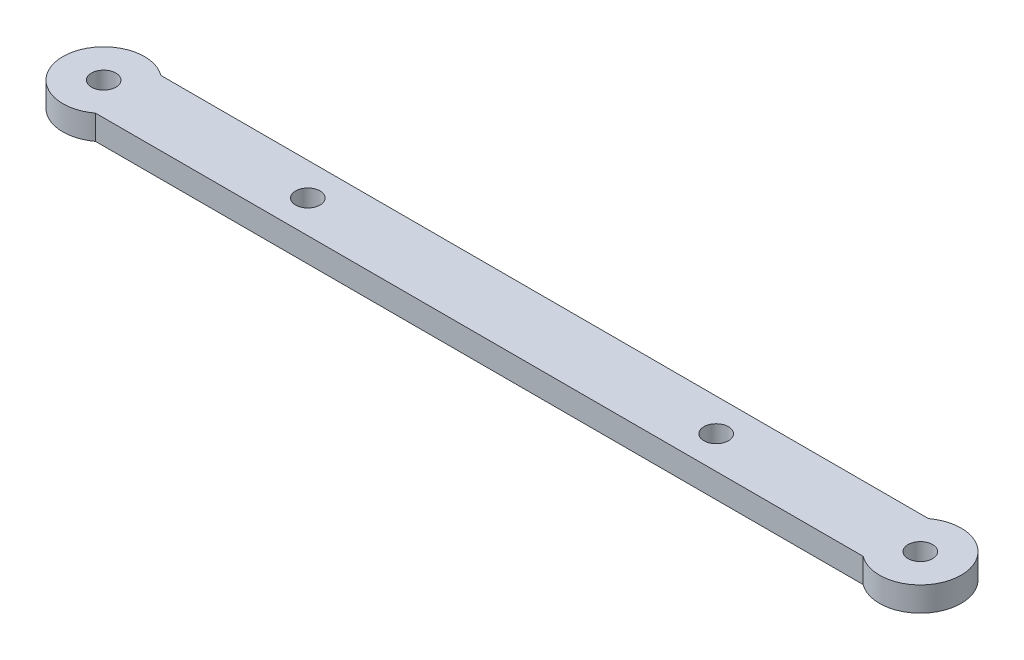
ISO-10303-21;
HEADER;
FILE_DESCRIPTION(('STEP AP214'),'2;1');
FILE_NAME('part.step','',(''),(''),'','','');
FILE_SCHEMA(('AUTOMOTIVE_DESIGN { 1 0 10303 214 1 1 1 1 }'));
ENDSEC;
DATA;
#1=APPLICATION_CONTEXT('core data for automotive mechanical design processes');
#2=APPLICATION_PROTOCOL_DEFINITION('international standard','automotive_design',2000,#1);
#3=PRODUCT_CONTEXT('',#1,'mechanical');
#4=PRODUCT('Part','Part','',(#3));
#5=PRODUCT_RELATED_PRODUCT_CATEGORY('part','',(#4));
#6=PRODUCT_DEFINITION_FORMATION('','',#4);
#7=PRODUCT_DEFINITION_CONTEXT('part definition',#1,'design');
#8=PRODUCT_DEFINITION('design','',#6,#7);
#9=PRODUCT_DEFINITION_SHAPE('','',#8);
#10=(LENGTH_UNIT() NAMED_UNIT(*) SI_UNIT(.MILLI.,.METRE.));
#11=(NAMED_UNIT(*) PLANE_ANGLE_UNIT() SI_UNIT($,.RADIAN.));
#12=(NAMED_UNIT(*) SI_UNIT($,.STERADIAN.) SOLID_ANGLE_UNIT());
#13=UNCERTAINTY_MEASURE_WITH_UNIT(LENGTH_MEASURE(1.E-05),#10,'distance_accuracy_value','');
#14=(GEOMETRIC_REPRESENTATION_CONTEXT(3) GLOBAL_UNCERTAINTY_ASSIGNED_CONTEXT((#13)) GLOBAL_UNIT_ASSIGNED_CONTEXT((#10,
#11,#12)) REPRESENTATION_CONTEXT('',''));
#15=CARTESIAN_POINT('',(0.,0.,0.));
#16=DIRECTION('',(0.,0.,1.));
#17=DIRECTION('',(1.,0.,0.));
#18=AXIS2_PLACEMENT_3D('',#15,#16,#17);
#19=CARTESIAN_POINT('',(50.,3.,0.));
#20=DIRECTION('',(0.,-1.,0.));
#21=DIRECTION('',(0.,0.,-1.));
#22=AXIS2_PLACEMENT_3D('',#19,#20,#21);
#23=PLANE('',#22);
#24=CARTESIAN_POINT('',(50.,3.,0.));
#25=DIRECTION('',(0.,1.,0.));
#26=DIRECTION('',(0.,0.,-1.));
#27=AXIS2_PLACEMENT_3D('',#24,#25,#26);
#28=CIRCLE('',#27,5.);
#29=CARTESIAN_POINT('',(47.,3.,3.99999999999999));
#30=VERTEX_POINT('',#29);
#31=CARTESIAN_POINT('',(47.,3.,-4.));
#32=VERTEX_POINT('',#31);
#33=EDGE_CURVE('E90',#30,#32,#28,.T.);
#34=ORIENTED_EDGE('',*,*,#33,.T.);
#35=DIRECTION('',(-1.,0.,0.));
#36=VECTOR('',#35,1.);
#37=CARTESIAN_POINT('',(-47.,3.,-4.));
#38=LINE('',#37,#36);
#39=CARTESIAN_POINT('',(-47.,3.,-4.));
#40=VERTEX_POINT('',#39);
#41=EDGE_CURVE('E85',#32,#40,#38,.T.);
#42=ORIENTED_EDGE('',*,*,#41,.T.);
#43=CARTESIAN_POINT('',(-50.,3.,0.));
#44=DIRECTION('',(0.,1.,0.));
#45=DIRECTION('',(0.,0.,1.));
#46=AXIS2_PLACEMENT_3D('',#43,#44,#45);
#47=CIRCLE('',#46,5.);
#48=CARTESIAN_POINT('',(-47.,3.,4.00000000000001));
#49=VERTEX_POINT('',#48);
#50=EDGE_CURVE('E88',#40,#49,#47,.T.);
#51=ORIENTED_EDGE('',*,*,#50,.T.);
#52=DIRECTION('',(1.,0.,0.));
#53=VECTOR('',#52,1.);
#54=CARTESIAN_POINT('',(47.,3.,3.99999999999999));
#55=LINE('',#54,#53);
#56=EDGE_CURVE('E55',#49,#30,#55,.T.);
#57=ORIENTED_EDGE('',*,*,#56,.T.);
#58=EDGE_LOOP('',(#34,#42,#51,#57));
#59=FACE_BOUND('',#58,.T.);
#60=CARTESIAN_POINT('',(-50.,3.,0.));
#61=DIRECTION('',(0.,1.,0.));
#62=DIRECTION('',(0.,0.,1.));
#63=AXIS2_PLACEMENT_3D('',#60,#61,#62);
#64=CIRCLE('',#63,1.5);
#65=CARTESIAN_POINT('',(-50.,3.,1.5));
#66=VERTEX_POINT('',#65);
#67=EDGE_CURVE('E105',#66,#66,#64,.T.);
#68=ORIENTED_EDGE('',*,*,#67,.F.);
#69=EDGE_LOOP('',(#68));
#70=FACE_BOUND('',#69,.T.);
#71=CARTESIAN_POINT('',(-25.,3.,0.));
#72=DIRECTION('',(0.,1.,0.));
#73=DIRECTION('',(0.,0.,1.));
#74=AXIS2_PLACEMENT_3D('',#71,#72,#73);
#75=CIRCLE('',#74,1.5);
#76=CARTESIAN_POINT('',(-25.,3.,1.5));
#77=VERTEX_POINT('',#76);
#78=EDGE_CURVE('E120',#77,#77,#75,.T.);
#79=ORIENTED_EDGE('',*,*,#78,.F.);
#80=EDGE_LOOP('',(#79));
#81=FACE_BOUND('',#80,.T.);
#82=CARTESIAN_POINT('',(50.,3.,0.));
#83=DIRECTION('',(0.,1.,0.));
#84=DIRECTION('',(0.,0.,-1.));
#85=AXIS2_PLACEMENT_3D('',#82,#83,#84);
#86=CIRCLE('',#85,1.5);
#87=CARTESIAN_POINT('',(50.,3.,-1.5));
#88=VERTEX_POINT('',#87);
#89=EDGE_CURVE('E126',#88,#88,#86,.T.);
#90=ORIENTED_EDGE('',*,*,#89,.F.);
#91=EDGE_LOOP('',(#90));
#92=FACE_BOUND('',#91,.T.);
#93=CARTESIAN_POINT('',(25.,3.,0.));
#94=DIRECTION('',(0.,1.,0.));
#95=DIRECTION('',(0.,0.,1.));
#96=AXIS2_PLACEMENT_3D('',#93,#94,#95);
#97=CIRCLE('',#96,1.5);
#98=CARTESIAN_POINT('',(25.,3.,1.5));
#99=VERTEX_POINT('',#98);
#100=EDGE_CURVE('E132',#99,#99,#97,.T.);
#101=ORIENTED_EDGE('',*,*,#100,.F.);
#102=EDGE_LOOP('',(#101));
#103=FACE_BOUND('',#102,.T.);
#104=ADVANCED_FACE('F38',(#59,#70,#81,#92,#103),#23,.F.);
#105=CARTESIAN_POINT('',(50.,0.,0.));
#106=DIRECTION('',(0.,-1.,0.));
#107=DIRECTION('',(0.,0.,-1.));
#108=AXIS2_PLACEMENT_3D('',#105,#106,#107);
#109=PLANE('',#108);
#110=CARTESIAN_POINT('',(50.,0.,0.));
#111=DIRECTION('',(0.,1.,0.));
#112=DIRECTION('',(0.,0.,-1.));
#113=AXIS2_PLACEMENT_3D('',#110,#111,#112);
#114=CIRCLE('',#113,1.5);
#115=CARTESIAN_POINT('',(50.,0.,-1.5));
#116=VERTEX_POINT('',#115);
#117=EDGE_CURVE('E129',#116,#116,#114,.T.);
#118=ORIENTED_EDGE('',*,*,#117,.T.);
#119=EDGE_LOOP('',(#118));
#120=FACE_BOUND('',#119,.T.);
#121=CARTESIAN_POINT('',(-50.,0.,0.));
#122=DIRECTION('',(0.,1.,0.));
#123=DIRECTION('',(0.,0.,1.));
#124=AXIS2_PLACEMENT_3D('',#121,#122,#123);
#125=CIRCLE('',#124,1.5);
#126=CARTESIAN_POINT('',(-50.,0.,1.5));
#127=VERTEX_POINT('',#126);
#128=EDGE_CURVE('E117',#127,#127,#125,.T.);
#129=ORIENTED_EDGE('',*,*,#128,.T.);
#130=EDGE_LOOP('',(#129));
#131=FACE_BOUND('',#130,.T.);
#132=CARTESIAN_POINT('',(50.,0.,0.));
#133=DIRECTION('',(0.,1.,0.));
#134=DIRECTION('',(0.,0.,-1.));
#135=AXIS2_PLACEMENT_3D('',#132,#133,#134);
#136=CIRCLE('',#135,5.);
#137=CARTESIAN_POINT('',(47.,0.,3.99999999999999));
#138=VERTEX_POINT('',#137);
#139=CARTESIAN_POINT('',(47.,0.,-4.));
#140=VERTEX_POINT('',#139);
#141=EDGE_CURVE('E102',#138,#140,#136,.T.);
#142=ORIENTED_EDGE('',*,*,#141,.F.);
#143=DIRECTION('',(1.,0.,0.));
#144=VECTOR('',#143,1.);
#145=CARTESIAN_POINT('',(47.,0.,3.99999999999999));
#146=LINE('',#145,#144);
#147=CARTESIAN_POINT('',(-47.,0.,4.00000000000001));
#148=VERTEX_POINT('',#147);
#149=EDGE_CURVE('E78',#148,#138,#146,.T.);
#150=ORIENTED_EDGE('',*,*,#149,.F.);
#151=CARTESIAN_POINT('',(-50.,0.,0.));
#152=DIRECTION('',(0.,1.,0.));
#153=DIRECTION('',(0.,0.,1.));
#154=AXIS2_PLACEMENT_3D('',#151,#152,#153);
#155=CIRCLE('',#154,5.);
#156=CARTESIAN_POINT('',(-47.,0.,-4.));
#157=VERTEX_POINT('',#156);
#158=EDGE_CURVE('E72',#157,#148,#155,.T.);
#159=ORIENTED_EDGE('',*,*,#158,.F.);
#160=DIRECTION('',(-1.,0.,0.));
#161=VECTOR('',#160,1.);
#162=CARTESIAN_POINT('',(-47.,0.,-4.));
#163=LINE('',#162,#161);
#164=EDGE_CURVE('E94',#140,#157,#163,.T.);
#165=ORIENTED_EDGE('',*,*,#164,.F.);
#166=EDGE_LOOP('',(#142,#150,#159,#165));
#167=FACE_BOUND('',#166,.T.);
#168=CARTESIAN_POINT('',(-25.,0.,0.));
#169=DIRECTION('',(0.,1.,0.));
#170=DIRECTION('',(0.,0.,1.));
#171=AXIS2_PLACEMENT_3D('',#168,#169,#170);
#172=CIRCLE('',#171,1.5);
#173=CARTESIAN_POINT('',(-25.,0.,1.5));
#174=VERTEX_POINT('',#173);
#175=EDGE_CURVE('E123',#174,#174,#172,.T.);
#176=ORIENTED_EDGE('',*,*,#175,.T.);
#177=EDGE_LOOP('',(#176));
#178=FACE_BOUND('',#177,.T.);
#179=CARTESIAN_POINT('',(25.,0.,0.));
#180=DIRECTION('',(0.,1.,0.));
#181=DIRECTION('',(0.,0.,1.));
#182=AXIS2_PLACEMENT_3D('',#179,#180,#181);
#183=CIRCLE('',#182,1.5);
#184=CARTESIAN_POINT('',(25.,0.,1.5));
#185=VERTEX_POINT('',#184);
#186=EDGE_CURVE('E135',#185,#185,#183,.T.);
#187=ORIENTED_EDGE('',*,*,#186,.T.);
#188=EDGE_LOOP('',(#187));
#189=FACE_BOUND('',#188,.T.);
#190=ADVANCED_FACE('F113',(#120,#131,#167,#178,#189),#109,.T.);
#191=CARTESIAN_POINT('',(50.,3.,0.));
#192=DIRECTION('',(0.,-1.,0.));
#193=DIRECTION('',(0.,0.,-1.));
#194=AXIS2_PLACEMENT_3D('',#191,#192,#193);
#195=CYLINDRICAL_SURFACE('',#194,5.);
#196=ORIENTED_EDGE('',*,*,#141,.T.);
#197=DIRECTION('',(0.,-1.,0.));
#198=VECTOR('',#197,1.);
#199=CARTESIAN_POINT('',(47.,3.,-4.));
#200=LINE('',#199,#198);
#201=EDGE_CURVE('E11',#32,#140,#200,.T.);
#202=ORIENTED_EDGE('',*,*,#201,.F.);
#203=ORIENTED_EDGE('',*,*,#33,.F.);
#204=DIRECTION('',(0.,-1.,0.));
#205=VECTOR('',#204,1.);
#206=CARTESIAN_POINT('',(47.,3.,3.99999999999999));
#207=LINE('',#206,#205);
#208=EDGE_CURVE('E98',#30,#138,#207,.T.);
#209=ORIENTED_EDGE('',*,*,#208,.T.);
#210=EDGE_LOOP('',(#196,#202,#203,#209));
#211=FACE_BOUND('',#210,.T.);
#212=ADVANCED_FACE('F40',(#211),#195,.T.);
#213=CARTESIAN_POINT('',(-47.,3.,-4.));
#214=DIRECTION('',(0.,0.,1.));
#215=DIRECTION('',(1.,0.,0.));
#216=AXIS2_PLACEMENT_3D('',#213,#214,#215);
#217=PLANE('',#216);
#218=ORIENTED_EDGE('',*,*,#164,.T.);
#219=DIRECTION('',(0.,-1.,0.));
#220=VECTOR('',#219,1.);
#221=CARTESIAN_POINT('',(-47.,3.,-4.));
#222=LINE('',#221,#220);
#223=EDGE_CURVE('E47',#40,#157,#222,.T.);
#224=ORIENTED_EDGE('',*,*,#223,.F.);
#225=ORIENTED_EDGE('',*,*,#41,.F.);
#226=ORIENTED_EDGE('',*,*,#201,.T.);
#227=EDGE_LOOP('',(#218,#224,#225,#226));
#228=FACE_BOUND('',#227,.T.);
#229=ADVANCED_FACE('F93',(#228),#217,.F.);
#230=CARTESIAN_POINT('',(-50.,3.,0.));
#231=DIRECTION('',(0.,-1.,0.));
#232=DIRECTION('',(0.,0.,-1.));
#233=AXIS2_PLACEMENT_3D('',#230,#231,#232);
#234=CYLINDRICAL_SURFACE('',#233,5.);
#235=ORIENTED_EDGE('',*,*,#158,.T.);
#236=DIRECTION('',(0.,-1.,0.));
#237=VECTOR('',#236,1.);
#238=CARTESIAN_POINT('',(-47.,3.,4.00000000000001));
#239=LINE('',#238,#237);
#240=EDGE_CURVE('E95',#49,#148,#239,.T.);
#241=ORIENTED_EDGE('',*,*,#240,.F.);
#242=ORIENTED_EDGE('',*,*,#50,.F.);
#243=ORIENTED_EDGE('',*,*,#223,.T.);
#244=EDGE_LOOP('',(#235,#241,#242,#243));
#245=FACE_BOUND('',#244,.T.);
#246=ADVANCED_FACE('F96',(#245),#234,.T.);
#247=CARTESIAN_POINT('',(47.,3.,3.99999999999999));
#248=DIRECTION('',(0.,0.,-1.));
#249=DIRECTION('',(-1.,0.,0.));
#250=AXIS2_PLACEMENT_3D('',#247,#248,#249);
#251=PLANE('',#250);
#252=ORIENTED_EDGE('',*,*,#149,.T.);
#253=ORIENTED_EDGE('',*,*,#208,.F.);
#254=ORIENTED_EDGE('',*,*,#56,.F.);
#255=ORIENTED_EDGE('',*,*,#240,.T.);
#256=EDGE_LOOP('',(#252,#253,#254,#255));
#257=FACE_BOUND('',#256,.T.);
#258=ADVANCED_FACE('F110',(#257),#251,.F.);
#259=CARTESIAN_POINT('',(-50.,3.,0.));
#260=DIRECTION('',(0.,-1.,0.));
#261=DIRECTION('',(0.,0.,-1.));
#262=AXIS2_PLACEMENT_3D('',#259,#260,#261);
#263=CYLINDRICAL_SURFACE('',#262,1.5);
#264=ORIENTED_EDGE('',*,*,#67,.T.);
#265=EDGE_LOOP('',(#264));
#266=FACE_BOUND('',#265,.T.);
#267=ORIENTED_EDGE('',*,*,#128,.F.);
#268=EDGE_LOOP('',(#267));
#269=FACE_BOUND('',#268,.T.);
#270=ADVANCED_FACE('F152',(#266,#269),#263,.F.);
#271=CARTESIAN_POINT('',(-25.,3.,0.));
#272=DIRECTION('',(0.,-1.,0.));
#273=DIRECTION('',(0.,0.,-1.));
#274=AXIS2_PLACEMENT_3D('',#271,#272,#273);
#275=CYLINDRICAL_SURFACE('',#274,1.5);
#276=ORIENTED_EDGE('',*,*,#78,.T.);
#277=EDGE_LOOP('',(#276));
#278=FACE_BOUND('',#277,.T.);
#279=ORIENTED_EDGE('',*,*,#175,.F.);
#280=EDGE_LOOP('',(#279));
#281=FACE_BOUND('',#280,.T.);
#282=ADVANCED_FACE('F206',(#278,#281),#275,.F.);
#283=CARTESIAN_POINT('',(50.,3.,0.));
#284=DIRECTION('',(0.,-1.,0.));
#285=DIRECTION('',(0.,0.,-1.));
#286=AXIS2_PLACEMENT_3D('',#283,#284,#285);
#287=CYLINDRICAL_SURFACE('',#286,1.5);
#288=ORIENTED_EDGE('',*,*,#89,.T.);
#289=EDGE_LOOP('',(#288));
#290=FACE_BOUND('',#289,.T.);
#291=ORIENTED_EDGE('',*,*,#117,.F.);
#292=EDGE_LOOP('',(#291));
#293=FACE_BOUND('',#292,.T.);
#294=ADVANCED_FACE('F215',(#290,#293),#287,.F.);
#295=CARTESIAN_POINT('',(25.,3.,0.));
#296=DIRECTION('',(0.,-1.,0.));
#297=DIRECTION('',(0.,0.,-1.));
#298=AXIS2_PLACEMENT_3D('',#295,#296,#297);
#299=CYLINDRICAL_SURFACE('',#298,1.5);
#300=ORIENTED_EDGE('',*,*,#100,.T.);
#301=EDGE_LOOP('',(#300));
#302=FACE_BOUND('',#301,.T.);
#303=ORIENTED_EDGE('',*,*,#186,.F.);
#304=EDGE_LOOP('',(#303));
#305=FACE_BOUND('',#304,.T.);
#306=ADVANCED_FACE('F141',(#302,#305),#299,.F.);
#307=CLOSED_SHELL('',(#104,#190,#212,#229,#246,#258,#270,#282,#294,#306));
#308=MANIFOLD_SOLID_BREP('B2',#307);
#309=ADVANCED_BREP_SHAPE_REPRESENTATION('',(#18,#308),#14);
#310=SHAPE_DEFINITION_REPRESENTATION(#9,#309);
ENDSEC;
END-ISO-10303-21;
